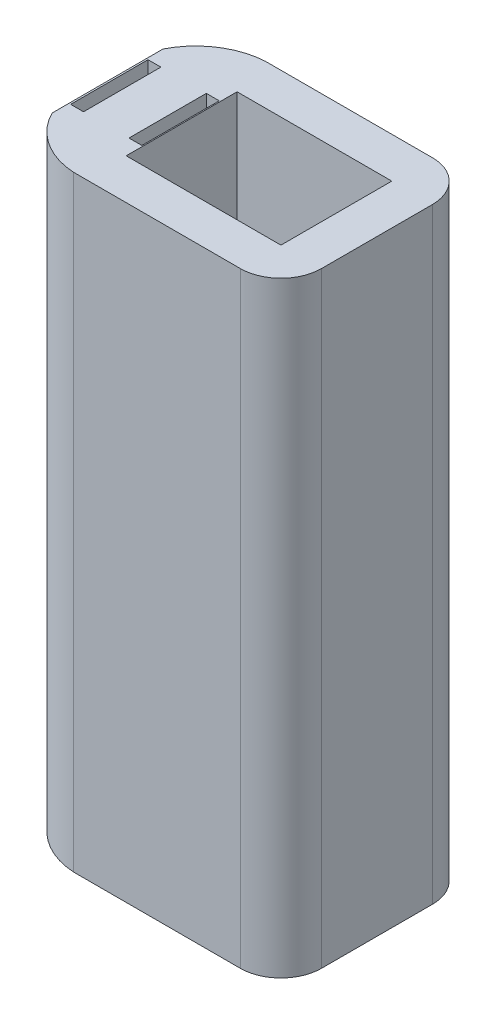
ISO-10303-21;
HEADER;
FILE_DESCRIPTION(('STEP AP214'),'2;1');
FILE_NAME('part.step','',(''),(''),'','','');
FILE_SCHEMA(('AUTOMOTIVE_DESIGN { 1 0 10303 214 1 1 1 1 }'));
ENDSEC;
DATA;
#1=APPLICATION_CONTEXT('core data for automotive mechanical design processes');
#2=APPLICATION_PROTOCOL_DEFINITION('international standard','automotive_design',2000,#1);
#3=PRODUCT_CONTEXT('',#1,'mechanical');
#4=PRODUCT('Part','Part','',(#3));
#5=PRODUCT_RELATED_PRODUCT_CATEGORY('part','',(#4));
#6=PRODUCT_DEFINITION_FORMATION('','',#4);
#7=PRODUCT_DEFINITION_CONTEXT('part definition',#1,'design');
#8=PRODUCT_DEFINITION('design','',#6,#7);
#9=PRODUCT_DEFINITION_SHAPE('','',#8);
#10=(LENGTH_UNIT() NAMED_UNIT(*) SI_UNIT(.MILLI.,.METRE.));
#11=(NAMED_UNIT(*) PLANE_ANGLE_UNIT() SI_UNIT($,.RADIAN.));
#12=(NAMED_UNIT(*) SI_UNIT($,.STERADIAN.) SOLID_ANGLE_UNIT());
#13=UNCERTAINTY_MEASURE_WITH_UNIT(LENGTH_MEASURE(1.E-05),#10,'distance_accuracy_value','');
#14=(GEOMETRIC_REPRESENTATION_CONTEXT(3) GLOBAL_UNCERTAINTY_ASSIGNED_CONTEXT((#13)) GLOBAL_UNIT_ASSIGNED_CONTEXT((#10,
#11,#12)) REPRESENTATION_CONTEXT('',''));
#15=CARTESIAN_POINT('',(0.,0.,0.));
#16=DIRECTION('',(0.,0.,1.));
#17=DIRECTION('',(1.,0.,0.));
#18=AXIS2_PLACEMENT_3D('',#15,#16,#17);
#19=CARTESIAN_POINT('',(60.,470.,43.));
#20=DIRECTION('',(0.,1.,0.));
#21=DIRECTION('',(0.,0.,1.));
#22=AXIS2_PLACEMENT_3D('',#19,#20,#21);
#23=PLANE('',#22);
#24=CARTESIAN_POINT('',(60.,470.,43.));
#25=DIRECTION('',(0.,1.,0.));
#26=DIRECTION('',(0.,0.,1.));
#27=AXIS2_PLACEMENT_3D('',#24,#25,#26);
#28=CIRCLE('',#27,31.46);
#29=CARTESIAN_POINT('',(59.9999999999998,470.,74.46));
#30=VERTEX_POINT('',#29);
#31=CARTESIAN_POINT('',(91.46,470.,42.9999999999998));
#32=VERTEX_POINT('',#31);
#33=EDGE_CURVE('E274',#30,#32,#28,.T.);
#34=ORIENTED_EDGE('',*,*,#33,.T.);
#35=DIRECTION('',(0.,0.,-1.));
#36=VECTOR('',#35,1.);
#37=CARTESIAN_POINT('',(91.46,470.,42.9999999999998));
#38=LINE('',#37,#36);
#39=CARTESIAN_POINT('',(91.46,470.,-42.9999999999998));
#40=VERTEX_POINT('',#39);
#41=EDGE_CURVE('E277',#32,#40,#38,.T.);
#42=ORIENTED_EDGE('',*,*,#41,.T.);
#43=CARTESIAN_POINT('',(60.,470.,-43.));
#44=DIRECTION('',(0.,1.,0.));
#45=DIRECTION('',(0.,0.,-1.));
#46=AXIS2_PLACEMENT_3D('',#43,#44,#45);
#47=CIRCLE('',#46,31.46);
#48=CARTESIAN_POINT('',(59.9999999999998,470.,-74.46));
#49=VERTEX_POINT('',#48);
#50=EDGE_CURVE('E280',#40,#49,#47,.T.);
#51=ORIENTED_EDGE('',*,*,#50,.T.);
#52=DIRECTION('',(-1.,0.,0.));
#53=VECTOR('',#52,1.);
#54=CARTESIAN_POINT('',(59.9999999999998,470.,-74.46));
#55=LINE('',#54,#53);
#56=CARTESIAN_POINT('',(-69.377570776842,470.,-74.46));
#57=VERTEX_POINT('',#56);
#58=EDGE_CURVE('E282',#49,#57,#55,.T.);
#59=ORIENTED_EDGE('',*,*,#58,.T.);
#60=CARTESIAN_POINT('',(-66.1736261853626,470.,-17.0893948170779));
#61=DIRECTION('',(0.,1.,0.));
#62=DIRECTION('',(0.,0.,-1.));
#63=AXIS2_PLACEMENT_3D('',#60,#61,#62);
#64=CIRCLE('',#63,57.46);
#65=CARTESIAN_POINT('',(-117.46,470.,-43.));
#66=VERTEX_POINT('',#65);
#67=EDGE_CURVE('E284',#57,#66,#64,.T.);
#68=ORIENTED_EDGE('',*,*,#67,.T.);
#69=DIRECTION('',(0.,0.,1.));
#70=VECTOR('',#69,1.);
#71=CARTESIAN_POINT('',(-117.46,470.,43.));
#72=LINE('',#71,#70);
#73=CARTESIAN_POINT('',(-117.46,470.,43.));
#74=VERTEX_POINT('',#73);
#75=EDGE_CURVE('E286',#66,#74,#72,.T.);
#76=ORIENTED_EDGE('',*,*,#75,.T.);
#77=CARTESIAN_POINT('',(-66.1736261853626,470.,17.0893948170779));
#78=DIRECTION('',(0.,1.,0.));
#79=DIRECTION('',(0.,0.,1.));
#80=AXIS2_PLACEMENT_3D('',#77,#78,#79);
#81=CIRCLE('',#80,57.46);
#82=CARTESIAN_POINT('',(-69.377570776842,470.,74.46));
#83=VERTEX_POINT('',#82);
#84=EDGE_CURVE('E288',#74,#83,#81,.T.);
#85=ORIENTED_EDGE('',*,*,#84,.T.);
#86=DIRECTION('',(1.,0.,0.));
#87=VECTOR('',#86,1.);
#88=CARTESIAN_POINT('',(59.9999999999998,470.,74.46));
#89=LINE('',#88,#87);
#90=EDGE_CURVE('E290',#83,#30,#89,.T.);
#91=ORIENTED_EDGE('',*,*,#90,.T.);
#92=EDGE_LOOP('',(#34,#42,#51,#59,#68,#76,#85,#91));
#93=FACE_BOUND('',#92,.T.);
#94=DIRECTION('',(1.,0.,0.));
#95=VECTOR('',#94,1.);
#96=CARTESIAN_POINT('',(60.,470.,43.));
#97=LINE('',#96,#95);
#98=CARTESIAN_POINT('',(-60.,470.,43.));
#99=VERTEX_POINT('',#98);
#100=CARTESIAN_POINT('',(60.,470.,43.));
#101=VERTEX_POINT('',#100);
#102=EDGE_CURVE('E245',#99,#101,#97,.T.);
#103=ORIENTED_EDGE('',*,*,#102,.F.);
#104=DIRECTION('',(0.,0.,1.));
#105=VECTOR('',#104,1.);
#106=CARTESIAN_POINT('',(-60.,470.,43.));
#107=LINE('',#106,#105);
#108=CARTESIAN_POINT('',(-60.,470.,-43.));
#109=VERTEX_POINT('',#108);
#110=EDGE_CURVE('E243',#109,#99,#107,.T.);
#111=ORIENTED_EDGE('',*,*,#110,.F.);
#112=DIRECTION('',(-1.,0.,0.));
#113=VECTOR('',#112,1.);
#114=CARTESIAN_POINT('',(60.,470.,-43.));
#115=LINE('',#114,#113);
#116=CARTESIAN_POINT('',(60.,470.,-43.));
#117=VERTEX_POINT('',#116);
#118=EDGE_CURVE('E251',#117,#109,#115,.T.);
#119=ORIENTED_EDGE('',*,*,#118,.F.);
#120=DIRECTION('',(0.,0.,-1.));
#121=VECTOR('',#120,1.);
#122=CARTESIAN_POINT('',(60.,470.,43.));
#123=LINE('',#122,#121);
#124=EDGE_CURVE('E248',#101,#117,#123,.T.);
#125=ORIENTED_EDGE('',*,*,#124,.F.);
#126=EDGE_LOOP('',(#103,#111,#119,#125));
#127=FACE_BOUND('',#126,.T.);
#128=DIRECTION('',(1.,0.,0.));
#129=VECTOR('',#128,1.);
#130=CARTESIAN_POINT('',(-70.86,470.,29.9795766122212));
#131=LINE('',#130,#129);
#132=CARTESIAN_POINT('',(-70.86,470.,29.9795766122212));
#133=VERTEX_POINT('',#132);
#134=CARTESIAN_POINT('',(-60.86,470.,29.9795766122212));
#135=VERTEX_POINT('',#134);
#136=EDGE_CURVE('E214',#133,#135,#131,.T.);
#137=ORIENTED_EDGE('',*,*,#136,.F.);
#138=DIRECTION('',(0.,0.,1.));
#139=VECTOR('',#138,1.);
#140=CARTESIAN_POINT('',(-70.86,470.,-30.0204233877788));
#141=LINE('',#140,#139);
#142=CARTESIAN_POINT('',(-70.86,470.,-30.0204233877788));
#143=VERTEX_POINT('',#142);
#144=EDGE_CURVE('E212',#143,#133,#141,.T.);
#145=ORIENTED_EDGE('',*,*,#144,.F.);
#146=DIRECTION('',(-1.,0.,0.));
#147=VECTOR('',#146,1.);
#148=CARTESIAN_POINT('',(-70.86,470.,-30.0204233877788));
#149=LINE('',#148,#147);
#150=CARTESIAN_POINT('',(-60.86,470.,-30.0204233877788));
#151=VERTEX_POINT('',#150);
#152=EDGE_CURVE('E220',#151,#143,#149,.T.);
#153=ORIENTED_EDGE('',*,*,#152,.F.);
#154=DIRECTION('',(0.,0.,-1.));
#155=VECTOR('',#154,1.);
#156=CARTESIAN_POINT('',(-60.86,470.,-30.0204233877788));
#157=LINE('',#156,#155);
#158=EDGE_CURVE('E217',#135,#151,#157,.T.);
#159=ORIENTED_EDGE('',*,*,#158,.F.);
#160=EDGE_LOOP('',(#137,#145,#153,#159));
#161=FACE_BOUND('',#160,.T.);
#162=DIRECTION('',(1.,0.,0.));
#163=VECTOR('',#162,1.);
#164=CARTESIAN_POINT('',(-116.1,470.,29.9795766122212));
#165=LINE('',#164,#163);
#166=CARTESIAN_POINT('',(-116.1,470.,29.9795766122212));
#167=VERTEX_POINT('',#166);
#168=CARTESIAN_POINT('',(-106.1,470.,29.9795766122212));
#169=VERTEX_POINT('',#168);
#170=EDGE_CURVE('E184',#167,#169,#165,.T.);
#171=ORIENTED_EDGE('',*,*,#170,.F.);
#172=DIRECTION('',(0.,0.,1.));
#173=VECTOR('',#172,1.);
#174=CARTESIAN_POINT('',(-116.1,470.,-30.0204233877788));
#175=LINE('',#174,#173);
#176=CARTESIAN_POINT('',(-116.1,470.,-30.0204233877788));
#177=VERTEX_POINT('',#176);
#178=EDGE_CURVE('E176',#177,#167,#175,.T.);
#179=ORIENTED_EDGE('',*,*,#178,.F.);
#180=DIRECTION('',(-1.,0.,0.));
#181=VECTOR('',#180,1.);
#182=CARTESIAN_POINT('',(-116.1,470.,-30.0204233877788));
#183=LINE('',#182,#181);
#184=CARTESIAN_POINT('',(-106.1,470.,-30.0204233877788));
#185=VERTEX_POINT('',#184);
#186=EDGE_CURVE('E198',#185,#177,#183,.T.);
#187=ORIENTED_EDGE('',*,*,#186,.F.);
#188=DIRECTION('',(0.,0.,-1.));
#189=VECTOR('',#188,1.);
#190=CARTESIAN_POINT('',(-106.1,470.,-30.0204233877788));
#191=LINE('',#190,#189);
#192=EDGE_CURVE('E196',#169,#185,#191,.T.);
#193=ORIENTED_EDGE('',*,*,#192,.F.);
#194=EDGE_LOOP('',(#171,#179,#187,#193));
#195=FACE_BOUND('',#194,.T.);
#196=ADVANCED_FACE('F39',(#93,#127,#161,#195),#23,.T.);
#197=CARTESIAN_POINT('',(60.,0.,43.));
#198=DIRECTION('',(0.,1.,0.));
#199=DIRECTION('',(0.,0.,1.));
#200=AXIS2_PLACEMENT_3D('',#197,#198,#199);
#201=PLANE('',#200);
#202=DIRECTION('',(0.,0.,1.));
#203=VECTOR('',#202,1.);
#204=CARTESIAN_POINT('',(-70.86,0.,-30.0204233877788));
#205=LINE('',#204,#203);
#206=CARTESIAN_POINT('',(-70.86,0.,-30.0204233877788));
#207=VERTEX_POINT('',#206);
#208=CARTESIAN_POINT('',(-70.86,0.,29.9795766122212));
#209=VERTEX_POINT('',#208);
#210=EDGE_CURVE('E192',#207,#209,#205,.T.);
#211=ORIENTED_EDGE('',*,*,#210,.T.);
#212=DIRECTION('',(1.,0.,0.));
#213=VECTOR('',#212,1.);
#214=CARTESIAN_POINT('',(-70.86,0.,29.9795766122212));
#215=LINE('',#214,#213);
#216=CARTESIAN_POINT('',(-60.86,0.,29.9795766122212));
#217=VERTEX_POINT('',#216);
#218=EDGE_CURVE('E225',#209,#217,#215,.T.);
#219=ORIENTED_EDGE('',*,*,#218,.T.);
#220=DIRECTION('',(0.,0.,-1.));
#221=VECTOR('',#220,1.);
#222=CARTESIAN_POINT('',(-60.86,0.,-30.0204233877788));
#223=LINE('',#222,#221);
#224=CARTESIAN_POINT('',(-60.86,0.,-30.0204233877788));
#225=VERTEX_POINT('',#224);
#226=EDGE_CURVE('E228',#217,#225,#223,.T.);
#227=ORIENTED_EDGE('',*,*,#226,.T.);
#228=DIRECTION('',(-1.,0.,0.));
#229=VECTOR('',#228,1.);
#230=CARTESIAN_POINT('',(-70.86,0.,-30.0204233877788));
#231=LINE('',#230,#229);
#232=EDGE_CURVE('E215',#225,#207,#231,.T.);
#233=ORIENTED_EDGE('',*,*,#232,.T.);
#234=EDGE_LOOP('',(#211,#219,#227,#233));
#235=FACE_BOUND('',#234,.T.);
#236=CARTESIAN_POINT('',(60.,0.,43.));
#237=DIRECTION('',(0.,1.,0.));
#238=DIRECTION('',(0.,0.,1.));
#239=AXIS2_PLACEMENT_3D('',#236,#237,#238);
#240=CIRCLE('',#239,31.46);
#241=CARTESIAN_POINT('',(59.9999999999998,0.,74.46));
#242=VERTEX_POINT('',#241);
#243=CARTESIAN_POINT('',(91.46,0.,42.9999999999998));
#244=VERTEX_POINT('',#243);
#245=EDGE_CURVE('E273',#242,#244,#240,.T.);
#246=ORIENTED_EDGE('',*,*,#245,.F.);
#247=DIRECTION('',(1.,0.,0.));
#248=VECTOR('',#247,1.);
#249=CARTESIAN_POINT('',(59.9999999999998,0.,74.46));
#250=LINE('',#249,#248);
#251=CARTESIAN_POINT('',(-69.377570776842,0.,74.46));
#252=VERTEX_POINT('',#251);
#253=EDGE_CURVE('E278',#252,#242,#250,.T.);
#254=ORIENTED_EDGE('',*,*,#253,.F.);
#255=CARTESIAN_POINT('',(-66.1736261853626,0.,17.0893948170779));
#256=DIRECTION('',(0.,1.,0.));
#257=DIRECTION('',(0.,0.,1.));
#258=AXIS2_PLACEMENT_3D('',#255,#256,#257);
#259=CIRCLE('',#258,57.46);
#260=CARTESIAN_POINT('',(-117.46,0.,43.));
#261=VERTEX_POINT('',#260);
#262=EDGE_CURVE('E305',#261,#252,#259,.T.);
#263=ORIENTED_EDGE('',*,*,#262,.F.);
#264=DIRECTION('',(0.,0.,1.));
#265=VECTOR('',#264,1.);
#266=CARTESIAN_POINT('',(-117.46,0.,43.));
#267=LINE('',#266,#265);
#268=CARTESIAN_POINT('',(-117.46,0.,-43.));
#269=VERTEX_POINT('',#268);
#270=EDGE_CURVE('E303',#269,#261,#267,.T.);
#271=ORIENTED_EDGE('',*,*,#270,.F.);
#272=CARTESIAN_POINT('',(-66.1736261853626,0.,-17.0893948170779));
#273=DIRECTION('',(0.,1.,0.));
#274=DIRECTION('',(0.,0.,-1.));
#275=AXIS2_PLACEMENT_3D('',#272,#273,#274);
#276=CIRCLE('',#275,57.46);
#277=CARTESIAN_POINT('',(-69.377570776842,0.,-74.46));
#278=VERTEX_POINT('',#277);
#279=EDGE_CURVE('E301',#278,#269,#276,.T.);
#280=ORIENTED_EDGE('',*,*,#279,.F.);
#281=DIRECTION('',(-1.,0.,0.));
#282=VECTOR('',#281,1.);
#283=CARTESIAN_POINT('',(59.9999999999998,0.,-74.46));
#284=LINE('',#283,#282);
#285=CARTESIAN_POINT('',(59.9999999999998,0.,-74.46));
#286=VERTEX_POINT('',#285);
#287=EDGE_CURVE('E299',#286,#278,#284,.T.);
#288=ORIENTED_EDGE('',*,*,#287,.F.);
#289=CARTESIAN_POINT('',(60.,0.,-43.));
#290=DIRECTION('',(0.,1.,0.));
#291=DIRECTION('',(0.,0.,-1.));
#292=AXIS2_PLACEMENT_3D('',#289,#290,#291);
#293=CIRCLE('',#292,31.46);
#294=CARTESIAN_POINT('',(91.46,0.,-42.9999999999998));
#295=VERTEX_POINT('',#294);
#296=EDGE_CURVE('E297',#295,#286,#293,.T.);
#297=ORIENTED_EDGE('',*,*,#296,.F.);
#298=DIRECTION('',(0.,0.,-1.));
#299=VECTOR('',#298,1.);
#300=CARTESIAN_POINT('',(91.46,0.,42.9999999999998));
#301=LINE('',#300,#299);
#302=EDGE_CURVE('E295',#244,#295,#301,.T.);
#303=ORIENTED_EDGE('',*,*,#302,.F.);
#304=EDGE_LOOP('',(#246,#254,#263,#271,#280,#288,#297,#303));
#305=FACE_BOUND('',#304,.T.);
#306=DIRECTION('',(0.,0.,1.));
#307=VECTOR('',#306,1.);
#308=CARTESIAN_POINT('',(-60.,0.,43.));
#309=LINE('',#308,#307);
#310=CARTESIAN_POINT('',(-60.,0.,-43.));
#311=VERTEX_POINT('',#310);
#312=CARTESIAN_POINT('',(-60.,0.,43.));
#313=VERTEX_POINT('',#312);
#314=EDGE_CURVE('E242',#311,#313,#309,.T.);
#315=ORIENTED_EDGE('',*,*,#314,.T.);
#316=DIRECTION('',(1.,0.,0.));
#317=VECTOR('',#316,1.);
#318=CARTESIAN_POINT('',(60.,0.,43.));
#319=LINE('',#318,#317);
#320=CARTESIAN_POINT('',(60.,0.,43.));
#321=VERTEX_POINT('',#320);
#322=EDGE_CURVE('E256',#313,#321,#319,.T.);
#323=ORIENTED_EDGE('',*,*,#322,.T.);
#324=DIRECTION('',(0.,0.,-1.));
#325=VECTOR('',#324,1.);
#326=CARTESIAN_POINT('',(60.,0.,43.));
#327=LINE('',#326,#325);
#328=CARTESIAN_POINT('',(60.,0.,-43.));
#329=VERTEX_POINT('',#328);
#330=EDGE_CURVE('E259',#321,#329,#327,.T.);
#331=ORIENTED_EDGE('',*,*,#330,.T.);
#332=DIRECTION('',(-1.,0.,0.));
#333=VECTOR('',#332,1.);
#334=CARTESIAN_POINT('',(60.,0.,-43.));
#335=LINE('',#334,#333);
#336=EDGE_CURVE('E246',#329,#311,#335,.T.);
#337=ORIENTED_EDGE('',*,*,#336,.T.);
#338=EDGE_LOOP('',(#315,#323,#331,#337));
#339=FACE_BOUND('',#338,.T.);
#340=DIRECTION('',(0.,0.,1.));
#341=VECTOR('',#340,1.);
#342=CARTESIAN_POINT('',(-116.1,0.,-30.0204233877788));
#343=LINE('',#342,#341);
#344=CARTESIAN_POINT('',(-116.1,0.,-30.0204233877788));
#345=VERTEX_POINT('',#344);
#346=CARTESIAN_POINT('',(-116.1,0.,29.9795766122212));
#347=VERTEX_POINT('',#346);
#348=EDGE_CURVE('E62',#345,#347,#343,.T.);
#349=ORIENTED_EDGE('',*,*,#348,.T.);
#350=DIRECTION('',(1.,0.,0.));
#351=VECTOR('',#350,1.);
#352=CARTESIAN_POINT('',(-116.1,0.,29.9795766122212));
#353=LINE('',#352,#351);
#354=CARTESIAN_POINT('',(-106.1,0.,29.9795766122212));
#355=VERTEX_POINT('',#354);
#356=EDGE_CURVE('E191',#347,#355,#353,.T.);
#357=ORIENTED_EDGE('',*,*,#356,.T.);
#358=DIRECTION('',(0.,0.,-1.));
#359=VECTOR('',#358,1.);
#360=CARTESIAN_POINT('',(-106.1,0.,-30.0204233877788));
#361=LINE('',#360,#359);
#362=CARTESIAN_POINT('',(-106.1,0.,-30.0204233877788));
#363=VERTEX_POINT('',#362);
#364=EDGE_CURVE('E204',#355,#363,#361,.T.);
#365=ORIENTED_EDGE('',*,*,#364,.T.);
#366=DIRECTION('',(-1.,0.,0.));
#367=VECTOR('',#366,1.);
#368=CARTESIAN_POINT('',(-116.1,0.,-30.0204233877788));
#369=LINE('',#368,#367);
#370=EDGE_CURVE('E185',#363,#345,#369,.T.);
#371=ORIENTED_EDGE('',*,*,#370,.T.);
#372=EDGE_LOOP('',(#349,#357,#365,#371));
#373=FACE_BOUND('',#372,.T.);
#374=ADVANCED_FACE('F335',(#235,#305,#339,#373),#201,.F.);
#375=CARTESIAN_POINT('',(60.,470.,43.));
#376=DIRECTION('',(0.,-1.,0.));
#377=DIRECTION('',(0.,0.,-1.));
#378=AXIS2_PLACEMENT_3D('',#375,#376,#377);
#379=CYLINDRICAL_SURFACE('',#378,31.46);
#380=ORIENTED_EDGE('',*,*,#245,.T.);
#381=DIRECTION('',(0.,-1.,0.));
#382=VECTOR('',#381,1.);
#383=CARTESIAN_POINT('',(91.46,470.,42.9999999999998));
#384=LINE('',#383,#382);
#385=EDGE_CURVE('E11',#32,#244,#384,.T.);
#386=ORIENTED_EDGE('',*,*,#385,.F.);
#387=ORIENTED_EDGE('',*,*,#33,.F.);
#388=DIRECTION('',(0.,-1.,0.));
#389=VECTOR('',#388,1.);
#390=CARTESIAN_POINT('',(59.9999999999998,470.,74.46));
#391=LINE('',#390,#389);
#392=EDGE_CURVE('E292',#30,#242,#391,.T.);
#393=ORIENTED_EDGE('',*,*,#392,.T.);
#394=EDGE_LOOP('',(#380,#386,#387,#393));
#395=FACE_BOUND('',#394,.T.);
#396=ADVANCED_FACE('F41',(#395),#379,.T.);
#397=CARTESIAN_POINT('',(91.46,470.,42.9999999999998));
#398=DIRECTION('',(-1.,0.,0.));
#399=DIRECTION('',(0.,0.,1.));
#400=AXIS2_PLACEMENT_3D('',#397,#398,#399);
#401=PLANE('',#400);
#402=ORIENTED_EDGE('',*,*,#302,.T.);
#403=DIRECTION('',(0.,-1.,0.));
#404=VECTOR('',#403,1.);
#405=CARTESIAN_POINT('',(91.46,470.,-42.9999999999998));
#406=LINE('',#405,#404);
#407=EDGE_CURVE('E47',#40,#295,#406,.T.);
#408=ORIENTED_EDGE('',*,*,#407,.F.);
#409=ORIENTED_EDGE('',*,*,#41,.F.);
#410=ORIENTED_EDGE('',*,*,#385,.T.);
#411=EDGE_LOOP('',(#402,#408,#409,#410));
#412=FACE_BOUND('',#411,.T.);
#413=ADVANCED_FACE('F353',(#412),#401,.F.);
#414=CARTESIAN_POINT('',(60.,470.,-43.));
#415=DIRECTION('',(0.,-1.,0.));
#416=DIRECTION('',(0.,0.,-1.));
#417=AXIS2_PLACEMENT_3D('',#414,#415,#416);
#418=CYLINDRICAL_SURFACE('',#417,31.46);
#419=ORIENTED_EDGE('',*,*,#296,.T.);
#420=DIRECTION('',(0.,-1.,0.));
#421=VECTOR('',#420,1.);
#422=CARTESIAN_POINT('',(59.9999999999998,470.,-74.46));
#423=LINE('',#422,#421);
#424=EDGE_CURVE('E322',#49,#286,#423,.T.);
#425=ORIENTED_EDGE('',*,*,#424,.F.);
#426=ORIENTED_EDGE('',*,*,#50,.F.);
#427=ORIENTED_EDGE('',*,*,#407,.T.);
#428=EDGE_LOOP('',(#419,#425,#426,#427));
#429=FACE_BOUND('',#428,.T.);
#430=ADVANCED_FACE('F329',(#429),#418,.T.);
#431=CARTESIAN_POINT('',(59.9999999999998,470.,-74.46));
#432=DIRECTION('',(0.,0.,1.));
#433=DIRECTION('',(1.,0.,0.));
#434=AXIS2_PLACEMENT_3D('',#431,#432,#433);
#435=PLANE('',#434);
#436=ORIENTED_EDGE('',*,*,#287,.T.);
#437=DIRECTION('',(0.,-1.,0.));
#438=VECTOR('',#437,1.);
#439=CARTESIAN_POINT('',(-69.377570776842,470.,-74.46));
#440=LINE('',#439,#438);
#441=EDGE_CURVE('E319',#57,#278,#440,.T.);
#442=ORIENTED_EDGE('',*,*,#441,.F.);
#443=ORIENTED_EDGE('',*,*,#58,.F.);
#444=ORIENTED_EDGE('',*,*,#424,.T.);
#445=EDGE_LOOP('',(#436,#442,#443,#444));
#446=FACE_BOUND('',#445,.T.);
#447=ADVANCED_FACE('F341',(#446),#435,.F.);
#448=CARTESIAN_POINT('',(-66.1736261853626,470.,-17.0893948170779));
#449=DIRECTION('',(0.,-1.,0.));
#450=DIRECTION('',(0.,0.,-1.));
#451=AXIS2_PLACEMENT_3D('',#448,#449,#450);
#452=CYLINDRICAL_SURFACE('',#451,57.46);
#453=ORIENTED_EDGE('',*,*,#279,.T.);
#454=DIRECTION('',(0.,-1.,0.));
#455=VECTOR('',#454,1.);
#456=CARTESIAN_POINT('',(-117.46,470.,-43.));
#457=LINE('',#456,#455);
#458=EDGE_CURVE('E316',#66,#269,#457,.T.);
#459=ORIENTED_EDGE('',*,*,#458,.F.);
#460=ORIENTED_EDGE('',*,*,#67,.F.);
#461=ORIENTED_EDGE('',*,*,#441,.T.);
#462=EDGE_LOOP('',(#453,#459,#460,#461));
#463=FACE_BOUND('',#462,.T.);
#464=ADVANCED_FACE('F345',(#463),#452,.T.);
#465=CARTESIAN_POINT('',(-117.46,470.,43.));
#466=DIRECTION('',(1.,0.,0.));
#467=DIRECTION('',(0.,0.,-1.));
#468=AXIS2_PLACEMENT_3D('',#465,#466,#467);
#469=PLANE('',#468);
#470=ORIENTED_EDGE('',*,*,#270,.T.);
#471=DIRECTION('',(0.,-1.,0.));
#472=VECTOR('',#471,1.);
#473=CARTESIAN_POINT('',(-117.46,470.,43.));
#474=LINE('',#473,#472);
#475=EDGE_CURVE('E313',#74,#261,#474,.T.);
#476=ORIENTED_EDGE('',*,*,#475,.F.);
#477=ORIENTED_EDGE('',*,*,#75,.F.);
#478=ORIENTED_EDGE('',*,*,#458,.T.);
#479=EDGE_LOOP('',(#470,#476,#477,#478));
#480=FACE_BOUND('',#479,.T.);
#481=ADVANCED_FACE('F366',(#480),#469,.F.);
#482=CARTESIAN_POINT('',(-66.1736261853626,470.,17.0893948170779));
#483=DIRECTION('',(0.,-1.,0.));
#484=DIRECTION('',(0.,0.,-1.));
#485=AXIS2_PLACEMENT_3D('',#482,#483,#484);
#486=CYLINDRICAL_SURFACE('',#485,57.46);
#487=ORIENTED_EDGE('',*,*,#262,.T.);
#488=DIRECTION('',(0.,-1.,0.));
#489=VECTOR('',#488,1.);
#490=CARTESIAN_POINT('',(-69.377570776842,470.,74.46));
#491=LINE('',#490,#489);
#492=EDGE_CURVE('E310',#83,#252,#491,.T.);
#493=ORIENTED_EDGE('',*,*,#492,.F.);
#494=ORIENTED_EDGE('',*,*,#84,.F.);
#495=ORIENTED_EDGE('',*,*,#475,.T.);
#496=EDGE_LOOP('',(#487,#493,#494,#495));
#497=FACE_BOUND('',#496,.T.);
#498=ADVANCED_FACE('F364',(#497),#486,.T.);
#499=CARTESIAN_POINT('',(59.9999999999998,470.,74.46));
#500=DIRECTION('',(0.,0.,-1.));
#501=DIRECTION('',(-1.,0.,0.));
#502=AXIS2_PLACEMENT_3D('',#499,#500,#501);
#503=PLANE('',#502);
#504=ORIENTED_EDGE('',*,*,#253,.T.);
#505=ORIENTED_EDGE('',*,*,#392,.F.);
#506=ORIENTED_EDGE('',*,*,#90,.F.);
#507=ORIENTED_EDGE('',*,*,#492,.T.);
#508=EDGE_LOOP('',(#504,#505,#506,#507));
#509=FACE_BOUND('',#508,.T.);
#510=ADVANCED_FACE('F359',(#509),#503,.F.);
#511=CARTESIAN_POINT('',(-60.,470.,43.));
#512=DIRECTION('',(1.,0.,0.));
#513=DIRECTION('',(0.,0.,-1.));
#514=AXIS2_PLACEMENT_3D('',#511,#512,#513);
#515=PLANE('',#514);
#516=ORIENTED_EDGE('',*,*,#314,.F.);
#517=DIRECTION('',(0.,-1.,0.));
#518=VECTOR('',#517,1.);
#519=CARTESIAN_POINT('',(-60.,470.,-43.));
#520=LINE('',#519,#518);
#521=EDGE_CURVE('E253',#109,#311,#520,.T.);
#522=ORIENTED_EDGE('',*,*,#521,.F.);
#523=ORIENTED_EDGE('',*,*,#110,.T.);
#524=DIRECTION('',(0.,-1.,0.));
#525=VECTOR('',#524,1.);
#526=CARTESIAN_POINT('',(-60.,470.,43.));
#527=LINE('',#526,#525);
#528=EDGE_CURVE('E270',#99,#313,#527,.T.);
#529=ORIENTED_EDGE('',*,*,#528,.T.);
#530=EDGE_LOOP('',(#516,#522,#523,#529));
#531=FACE_BOUND('',#530,.T.);
#532=ADVANCED_FACE('F383',(#531),#515,.T.);
#533=CARTESIAN_POINT('',(60.,470.,43.));
#534=DIRECTION('',(0.,0.,-1.));
#535=DIRECTION('',(-1.,0.,0.));
#536=AXIS2_PLACEMENT_3D('',#533,#534,#535);
#537=PLANE('',#536);
#538=ORIENTED_EDGE('',*,*,#322,.F.);
#539=ORIENTED_EDGE('',*,*,#528,.F.);
#540=ORIENTED_EDGE('',*,*,#102,.T.);
#541=DIRECTION('',(0.,-1.,0.));
#542=VECTOR('',#541,1.);
#543=CARTESIAN_POINT('',(60.,470.,43.));
#544=LINE('',#543,#542);
#545=EDGE_CURVE('E268',#101,#321,#544,.T.);
#546=ORIENTED_EDGE('',*,*,#545,.T.);
#547=EDGE_LOOP('',(#538,#539,#540,#546));
#548=FACE_BOUND('',#547,.T.);
#549=ADVANCED_FACE('F390',(#548),#537,.T.);
#550=CARTESIAN_POINT('',(60.,470.,43.));
#551=DIRECTION('',(-1.,0.,0.));
#552=DIRECTION('',(0.,0.,1.));
#553=AXIS2_PLACEMENT_3D('',#550,#551,#552);
#554=PLANE('',#553);
#555=ORIENTED_EDGE('',*,*,#330,.F.);
#556=ORIENTED_EDGE('',*,*,#545,.F.);
#557=ORIENTED_EDGE('',*,*,#124,.T.);
#558=DIRECTION('',(0.,-1.,0.));
#559=VECTOR('',#558,1.);
#560=CARTESIAN_POINT('',(60.,470.,-43.));
#561=LINE('',#560,#559);
#562=EDGE_CURVE('E266',#117,#329,#561,.T.);
#563=ORIENTED_EDGE('',*,*,#562,.T.);
#564=EDGE_LOOP('',(#555,#556,#557,#563));
#565=FACE_BOUND('',#564,.T.);
#566=ADVANCED_FACE('F395',(#565),#554,.T.);
#567=CARTESIAN_POINT('',(60.,470.,-43.));
#568=DIRECTION('',(0.,0.,1.));
#569=DIRECTION('',(1.,0.,0.));
#570=AXIS2_PLACEMENT_3D('',#567,#568,#569);
#571=PLANE('',#570);
#572=ORIENTED_EDGE('',*,*,#336,.F.);
#573=ORIENTED_EDGE('',*,*,#562,.F.);
#574=ORIENTED_EDGE('',*,*,#118,.T.);
#575=ORIENTED_EDGE('',*,*,#521,.T.);
#576=EDGE_LOOP('',(#572,#573,#574,#575));
#577=FACE_BOUND('',#576,.T.);
#578=ADVANCED_FACE('F402',(#577),#571,.T.);
#579=CARTESIAN_POINT('',(-70.86,470.,-30.0204233877788));
#580=DIRECTION('',(1.,0.,0.));
#581=DIRECTION('',(0.,0.,-1.));
#582=AXIS2_PLACEMENT_3D('',#579,#580,#581);
#583=PLANE('',#582);
#584=ORIENTED_EDGE('',*,*,#210,.F.);
#585=DIRECTION('',(0.,-1.,0.));
#586=VECTOR('',#585,1.);
#587=CARTESIAN_POINT('',(-70.86,470.,-30.0204233877788));
#588=LINE('',#587,#586);
#589=EDGE_CURVE('E222',#143,#207,#588,.T.);
#590=ORIENTED_EDGE('',*,*,#589,.F.);
#591=ORIENTED_EDGE('',*,*,#144,.T.);
#592=DIRECTION('',(0.,-1.,0.));
#593=VECTOR('',#592,1.);
#594=CARTESIAN_POINT('',(-70.86,470.,29.9795766122212));
#595=LINE('',#594,#593);
#596=EDGE_CURVE('E239',#133,#209,#595,.T.);
#597=ORIENTED_EDGE('',*,*,#596,.T.);
#598=EDGE_LOOP('',(#584,#590,#591,#597));
#599=FACE_BOUND('',#598,.T.);
#600=ADVANCED_FACE('F424',(#599),#583,.T.);
#601=CARTESIAN_POINT('',(-70.86,470.,29.9795766122212));
#602=DIRECTION('',(0.,0.,-1.));
#603=DIRECTION('',(-1.,0.,0.));
#604=AXIS2_PLACEMENT_3D('',#601,#602,#603);
#605=PLANE('',#604);
#606=ORIENTED_EDGE('',*,*,#218,.F.);
#607=ORIENTED_EDGE('',*,*,#596,.F.);
#608=ORIENTED_EDGE('',*,*,#136,.T.);
#609=DIRECTION('',(0.,-1.,0.));
#610=VECTOR('',#609,1.);
#611=CARTESIAN_POINT('',(-60.86,470.,29.9795766122212));
#612=LINE('',#611,#610);
#613=EDGE_CURVE('E237',#135,#217,#612,.T.);
#614=ORIENTED_EDGE('',*,*,#613,.T.);
#615=EDGE_LOOP('',(#606,#607,#608,#614));
#616=FACE_BOUND('',#615,.T.);
#617=ADVANCED_FACE('F418',(#616),#605,.T.);
#618=CARTESIAN_POINT('',(-60.86,470.,-30.0204233877788));
#619=DIRECTION('',(-1.,0.,0.));
#620=DIRECTION('',(0.,0.,1.));
#621=AXIS2_PLACEMENT_3D('',#618,#619,#620);
#622=PLANE('',#621);
#623=ORIENTED_EDGE('',*,*,#226,.F.);
#624=ORIENTED_EDGE('',*,*,#613,.F.);
#625=ORIENTED_EDGE('',*,*,#158,.T.);
#626=DIRECTION('',(0.,-1.,0.));
#627=VECTOR('',#626,1.);
#628=CARTESIAN_POINT('',(-60.86,470.,-30.0204233877788));
#629=LINE('',#628,#627);
#630=EDGE_CURVE('E235',#151,#225,#629,.T.);
#631=ORIENTED_EDGE('',*,*,#630,.T.);
#632=EDGE_LOOP('',(#623,#624,#625,#631));
#633=FACE_BOUND('',#632,.T.);
#634=ADVANCED_FACE('F421',(#633),#622,.T.);
#635=CARTESIAN_POINT('',(-70.86,470.,-30.0204233877788));
#636=DIRECTION('',(0.,0.,1.));
#637=DIRECTION('',(1.,0.,0.));
#638=AXIS2_PLACEMENT_3D('',#635,#636,#637);
#639=PLANE('',#638);
#640=ORIENTED_EDGE('',*,*,#232,.F.);
#641=ORIENTED_EDGE('',*,*,#630,.F.);
#642=ORIENTED_EDGE('',*,*,#152,.T.);
#643=ORIENTED_EDGE('',*,*,#589,.T.);
#644=EDGE_LOOP('',(#640,#641,#642,#643));
#645=FACE_BOUND('',#644,.T.);
#646=ADVANCED_FACE('F427',(#645),#639,.T.);
#647=CARTESIAN_POINT('',(-116.1,470.,-30.0204233877788));
#648=DIRECTION('',(1.,0.,0.));
#649=DIRECTION('',(0.,0.,-1.));
#650=AXIS2_PLACEMENT_3D('',#647,#648,#649);
#651=PLANE('',#650);
#652=ORIENTED_EDGE('',*,*,#348,.F.);
#653=DIRECTION('',(0.,-1.,0.));
#654=VECTOR('',#653,1.);
#655=CARTESIAN_POINT('',(-116.1,470.,-30.0204233877788));
#656=LINE('',#655,#654);
#657=EDGE_CURVE('E180',#177,#345,#656,.T.);
#658=ORIENTED_EDGE('',*,*,#657,.F.);
#659=ORIENTED_EDGE('',*,*,#178,.T.);
#660=DIRECTION('',(0.,-1.,0.));
#661=VECTOR('',#660,1.);
#662=CARTESIAN_POINT('',(-116.1,470.,29.9795766122212));
#663=LINE('',#662,#661);
#664=EDGE_CURVE('E179',#167,#347,#663,.T.);
#665=ORIENTED_EDGE('',*,*,#664,.T.);
#666=EDGE_LOOP('',(#652,#658,#659,#665));
#667=FACE_BOUND('',#666,.T.);
#668=ADVANCED_FACE('F178',(#667),#651,.T.);
#669=CARTESIAN_POINT('',(-116.1,470.,29.9795766122212));
#670=DIRECTION('',(0.,0.,-1.));
#671=DIRECTION('',(-1.,0.,0.));
#672=AXIS2_PLACEMENT_3D('',#669,#670,#671);
#673=PLANE('',#672);
#674=ORIENTED_EDGE('',*,*,#356,.F.);
#675=ORIENTED_EDGE('',*,*,#664,.F.);
#676=ORIENTED_EDGE('',*,*,#170,.T.);
#677=DIRECTION('',(0.,-1.,0.));
#678=VECTOR('',#677,1.);
#679=CARTESIAN_POINT('',(-106.1,470.,29.9795766122212));
#680=LINE('',#679,#678);
#681=EDGE_CURVE('E193',#169,#355,#680,.T.);
#682=ORIENTED_EDGE('',*,*,#681,.T.);
#683=EDGE_LOOP('',(#674,#675,#676,#682));
#684=FACE_BOUND('',#683,.T.);
#685=ADVANCED_FACE('F188',(#684),#673,.T.);
#686=CARTESIAN_POINT('',(-106.1,470.,-30.0204233877788));
#687=DIRECTION('',(-1.,0.,0.));
#688=DIRECTION('',(0.,0.,1.));
#689=AXIS2_PLACEMENT_3D('',#686,#687,#688);
#690=PLANE('',#689);
#691=ORIENTED_EDGE('',*,*,#364,.F.);
#692=ORIENTED_EDGE('',*,*,#681,.F.);
#693=ORIENTED_EDGE('',*,*,#192,.T.);
#694=DIRECTION('',(0.,-1.,0.));
#695=VECTOR('',#694,1.);
#696=CARTESIAN_POINT('',(-106.1,470.,-30.0204233877788));
#697=LINE('',#696,#695);
#698=EDGE_CURVE('E54',#185,#363,#697,.T.);
#699=ORIENTED_EDGE('',*,*,#698,.T.);
#700=EDGE_LOOP('',(#691,#692,#693,#699));
#701=FACE_BOUND('',#700,.T.);
#702=ADVANCED_FACE('F489',(#701),#690,.T.);
#703=CARTESIAN_POINT('',(-116.1,470.,-30.0204233877788));
#704=DIRECTION('',(0.,0.,1.));
#705=DIRECTION('',(1.,0.,0.));
#706=AXIS2_PLACEMENT_3D('',#703,#704,#705);
#707=PLANE('',#706);
#708=ORIENTED_EDGE('',*,*,#370,.F.);
#709=ORIENTED_EDGE('',*,*,#698,.F.);
#710=ORIENTED_EDGE('',*,*,#186,.T.);
#711=ORIENTED_EDGE('',*,*,#657,.T.);
#712=EDGE_LOOP('',(#708,#709,#710,#711));
#713=FACE_BOUND('',#712,.T.);
#714=ADVANCED_FACE('F497',(#713),#707,.T.);
#715=CLOSED_SHELL('',(#196,#374,#396,#413,#430,#447,#464,#481,#498,#510,#532,#549,#566,#578,
#600,#617,#634,#646,#668,#685,#702,#714));
#716=MANIFOLD_SOLID_BREP('B2',#715);
#717=ADVANCED_BREP_SHAPE_REPRESENTATION('',(#18,#716),#14);
#718=SHAPE_DEFINITION_REPRESENTATION(#9,#717);
ENDSEC;
END-ISO-10303-21;
